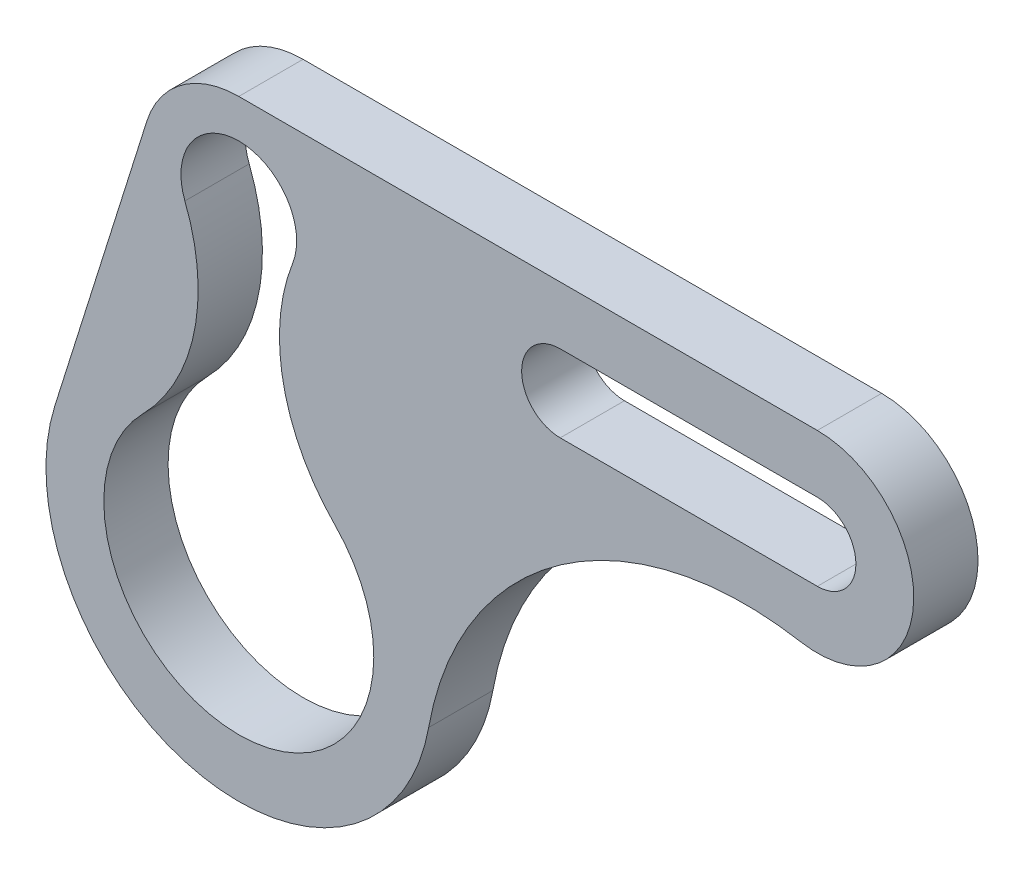
ISO-10303-21;
HEADER;
FILE_DESCRIPTION(('STEP AP214'),'2;1');
FILE_NAME('part.step','',(''),(''),'','','');
FILE_SCHEMA(('AUTOMOTIVE_DESIGN { 1 0 10303 214 1 1 1 1 }'));
ENDSEC;
DATA;
#1=APPLICATION_CONTEXT('core data for automotive mechanical design processes');
#2=APPLICATION_PROTOCOL_DEFINITION('international standard','automotive_design',2000,#1);
#3=PRODUCT_CONTEXT('',#1,'mechanical');
#4=PRODUCT('Part','Part','',(#3));
#5=PRODUCT_RELATED_PRODUCT_CATEGORY('part','',(#4));
#6=PRODUCT_DEFINITION_FORMATION('','',#4);
#7=PRODUCT_DEFINITION_CONTEXT('part definition',#1,'design');
#8=PRODUCT_DEFINITION('design','',#6,#7);
#9=PRODUCT_DEFINITION_SHAPE('','',#8);
#10=(LENGTH_UNIT() NAMED_UNIT(*) SI_UNIT(.MILLI.,.METRE.));
#11=(NAMED_UNIT(*) PLANE_ANGLE_UNIT() SI_UNIT($,.RADIAN.));
#12=(NAMED_UNIT(*) SI_UNIT($,.STERADIAN.) SOLID_ANGLE_UNIT());
#13=UNCERTAINTY_MEASURE_WITH_UNIT(LENGTH_MEASURE(1.E-05),#10,'distance_accuracy_value','');
#14=(GEOMETRIC_REPRESENTATION_CONTEXT(3) GLOBAL_UNCERTAINTY_ASSIGNED_CONTEXT((#13)) GLOBAL_UNIT_ASSIGNED_CONTEXT((#10,
#11,#12)) REPRESENTATION_CONTEXT('',''));
#15=CARTESIAN_POINT('',(0.,0.,0.));
#16=DIRECTION('',(0.,0.,1.));
#17=DIRECTION('',(1.,0.,0.));
#18=AXIS2_PLACEMENT_3D('',#15,#16,#17);
#19=CARTESIAN_POINT('',(0.,50.,5.));
#20=DIRECTION('',(0.,0.,1.));
#21=DIRECTION('',(1.,0.,0.));
#22=AXIS2_PLACEMENT_3D('',#19,#20,#21);
#23=PLANE('',#22);
#24=CARTESIAN_POINT('',(0.,50.,5.));
#25=DIRECTION('',(0.,0.,1.));
#26=DIRECTION('',(1.,0.,0.));
#27=AXIS2_PLACEMENT_3D('',#24,#25,#26);
#28=CIRCLE('',#27,15.);
#29=CARTESIAN_POINT('',(0.,65.,5.));
#30=VERTEX_POINT('',#29);
#31=CARTESIAN_POINT('',(-14.3090880212542,54.5,5.));
#32=VERTEX_POINT('',#31);
#33=EDGE_CURVE('E236',#30,#32,#28,.T.);
#34=ORIENTED_EDGE('',*,*,#33,.T.);
#35=DIRECTION('',(-0.3,-0.953939201416946,0.));
#36=VECTOR('',#35,1.);
#37=CARTESIAN_POINT('',(-14.3090880212542,54.5,5.));
#38=LINE('',#37,#36);
#39=CARTESIAN_POINT('',(-28.6181760425084,9.,5.));
#40=VERTEX_POINT('',#39);
#41=EDGE_CURVE('E240',#32,#40,#38,.T.);
#42=ORIENTED_EDGE('',*,*,#41,.T.);
#43=CARTESIAN_POINT('',(0.,0.,5.));
#44=DIRECTION('',(0.,0.,1.));
#45=DIRECTION('',(1.,0.,0.));
#46=AXIS2_PLACEMENT_3D('',#43,#44,#45);
#47=CIRCLE('',#46,30.);
#48=CARTESIAN_POINT('',(29.5356455942332,-5.25791206961977,5.));
#49=VERTEX_POINT('',#48);
#50=EDGE_CURVE('E244',#40,#49,#47,.T.);
#51=ORIENTED_EDGE('',*,*,#50,.T.);
#52=CARTESIAN_POINT('',(78.7617215846219,-14.0210988523194,5.));
#53=DIRECTION('',(0.,0.,-1.));
#54=DIRECTION('',(1.,0.,0.));
#55=AXIS2_PLACEMENT_3D('',#52,#53,#54);
#56=CIRCLE('',#55,50.);
#57=CARTESIAN_POINT('',(87.4065511349127,35.2259002648494,5.));
#58=VERTEX_POINT('',#57);
#59=EDGE_CURVE('E247',#49,#58,#56,.T.);
#60=ORIENTED_EDGE('',*,*,#59,.T.);
#61=CARTESIAN_POINT('',(90.,50.,5.));
#62=DIRECTION('',(0.,0.,1.));
#63=DIRECTION('',(-1.,0.,0.));
#64=AXIS2_PLACEMENT_3D('',#61,#62,#63);
#65=CIRCLE('',#64,15.);
#66=CARTESIAN_POINT('',(90.,65.,5.));
#67=VERTEX_POINT('',#66);
#68=EDGE_CURVE('E250',#58,#67,#65,.T.);
#69=ORIENTED_EDGE('',*,*,#68,.T.);
#70=DIRECTION('',(-1.,0.,0.));
#71=VECTOR('',#70,1.);
#72=CARTESIAN_POINT('',(0.,65.,5.));
#73=LINE('',#72,#71);
#74=EDGE_CURVE('E253',#67,#30,#73,.T.);
#75=ORIENTED_EDGE('',*,*,#74,.T.);
#76=EDGE_LOOP('',(#34,#42,#51,#60,#69,#75));
#77=FACE_BOUND('',#76,.T.);
#78=DIRECTION('',(1.,0.,0.));
#79=VECTOR('',#78,1.);
#80=CARTESIAN_POINT('',(50.,44.,5.));
#81=LINE('',#80,#79);
#82=CARTESIAN_POINT('',(50.,44.,5.));
#83=VERTEX_POINT('',#82);
#84=CARTESIAN_POINT('',(90.,44.,5.));
#85=VERTEX_POINT('',#84);
#86=EDGE_CURVE('E196',#83,#85,#81,.T.);
#87=ORIENTED_EDGE('',*,*,#86,.F.);
#88=CARTESIAN_POINT('',(50.,50.,5.));
#89=DIRECTION('',(0.,0.,1.));
#90=DIRECTION('',(1.,0.,0.));
#91=AXIS2_PLACEMENT_3D('',#88,#89,#90);
#92=CIRCLE('',#91,6.);
#93=CARTESIAN_POINT('',(50.,56.,5.));
#94=VERTEX_POINT('',#93);
#95=EDGE_CURVE('E193',#94,#83,#92,.T.);
#96=ORIENTED_EDGE('',*,*,#95,.F.);
#97=DIRECTION('',(-1.,0.,0.));
#98=VECTOR('',#97,1.);
#99=CARTESIAN_POINT('',(50.,56.,5.));
#100=LINE('',#99,#98);
#101=CARTESIAN_POINT('',(90.,56.,5.));
#102=VERTEX_POINT('',#101);
#103=EDGE_CURVE('E204',#102,#94,#100,.T.);
#104=ORIENTED_EDGE('',*,*,#103,.F.);
#105=CARTESIAN_POINT('',(90.,50.,5.));
#106=DIRECTION('',(0.,0.,1.));
#107=DIRECTION('',(1.,0.,0.));
#108=AXIS2_PLACEMENT_3D('',#105,#106,#107);
#109=CIRCLE('',#108,6.);
#110=EDGE_CURVE('E200',#85,#102,#109,.T.);
#111=ORIENTED_EDGE('',*,*,#110,.F.);
#112=EDGE_LOOP('',(#87,#96,#104,#111));
#113=FACE_BOUND('',#112,.T.);
#114=CARTESIAN_POINT('',(0.,50.,5.));
#115=DIRECTION('',(0.,0.,1.));
#116=DIRECTION('',(1.,0.,0.));
#117=AXIS2_PLACEMENT_3D('',#114,#115,#116);
#118=CIRCLE('',#117,9.00000000000001);
#119=CARTESIAN_POINT('',(8.3822297241205,46.7230769230769,5.));
#120=VERTEX_POINT('',#119);
#121=CARTESIAN_POINT('',(-8.38222972412048,46.7230769230769,5.));
#122=VERTEX_POINT('',#121);
#123=EDGE_CURVE('E154',#120,#122,#118,.T.);
#124=ORIENTED_EDGE('',*,*,#123,.F.);
#125=CARTESIAN_POINT('',(36.3229954711888,35.8,5.));
#126=DIRECTION('',(0.,0.,-1.));
#127=DIRECTION('',(1.,0.,0.));
#128=AXIS2_PLACEMENT_3D('',#125,#126,#127);
#129=CIRCLE('',#128,30.);
#130=CARTESIAN_POINT('',(14.9565275469601,14.7411764705882,5.));
#131=VERTEX_POINT('',#130);
#132=EDGE_CURVE('E145',#131,#120,#129,.T.);
#133=ORIENTED_EDGE('',*,*,#132,.F.);
#134=CARTESIAN_POINT('',(0.,0.,5.));
#135=DIRECTION('',(0.,0.,1.));
#136=DIRECTION('',(1.,0.,0.));
#137=AXIS2_PLACEMENT_3D('',#134,#135,#136);
#138=CIRCLE('',#137,21.);
#139=CARTESIAN_POINT('',(-14.9565275469601,14.7411764705882,5.));
#140=VERTEX_POINT('',#139);
#141=EDGE_CURVE('E171',#140,#131,#138,.T.);
#142=ORIENTED_EDGE('',*,*,#141,.F.);
#143=CARTESIAN_POINT('',(-36.3229954711888,35.8,5.));
#144=DIRECTION('',(0.,0.,-1.));
#145=DIRECTION('',(-1.,0.,0.));
#146=AXIS2_PLACEMENT_3D('',#143,#144,#145);
#147=CIRCLE('',#146,30.);
#148=EDGE_CURVE('E167',#122,#140,#147,.T.);
#149=ORIENTED_EDGE('',*,*,#148,.F.);
#150=EDGE_LOOP('',(#124,#133,#142,#149));
#151=FACE_BOUND('',#150,.T.);
#152=ADVANCED_FACE('F43',(#77,#113,#151),#23,.T.);
#153=CARTESIAN_POINT('',(0.,50.,-5.));
#154=DIRECTION('',(0.,0.,1.));
#155=DIRECTION('',(1.,0.,0.));
#156=AXIS2_PLACEMENT_3D('',#153,#154,#155);
#157=PLANE('',#156);
#158=CARTESIAN_POINT('',(50.,50.,-5.));
#159=DIRECTION('',(0.,0.,1.));
#160=DIRECTION('',(1.,0.,0.));
#161=AXIS2_PLACEMENT_3D('',#158,#159,#160);
#162=CIRCLE('',#161,6.);
#163=CARTESIAN_POINT('',(50.,56.,-5.));
#164=VERTEX_POINT('',#163);
#165=CARTESIAN_POINT('',(50.,44.,-5.));
#166=VERTEX_POINT('',#165);
#167=EDGE_CURVE('E163',#164,#166,#162,.T.);
#168=ORIENTED_EDGE('',*,*,#167,.T.);
#169=DIRECTION('',(1.,0.,0.));
#170=VECTOR('',#169,1.);
#171=CARTESIAN_POINT('',(50.,44.,-5.));
#172=LINE('',#171,#170);
#173=CARTESIAN_POINT('',(90.,44.,-5.));
#174=VERTEX_POINT('',#173);
#175=EDGE_CURVE('E211',#166,#174,#172,.T.);
#176=ORIENTED_EDGE('',*,*,#175,.T.);
#177=CARTESIAN_POINT('',(90.,50.,-5.));
#178=DIRECTION('',(0.,0.,1.));
#179=DIRECTION('',(1.,0.,0.));
#180=AXIS2_PLACEMENT_3D('',#177,#178,#179);
#181=CIRCLE('',#180,6.);
#182=CARTESIAN_POINT('',(90.,56.,-5.));
#183=VERTEX_POINT('',#182);
#184=EDGE_CURVE('E215',#174,#183,#181,.T.);
#185=ORIENTED_EDGE('',*,*,#184,.T.);
#186=DIRECTION('',(-1.,0.,0.));
#187=VECTOR('',#186,1.);
#188=CARTESIAN_POINT('',(50.,56.,-5.));
#189=LINE('',#188,#187);
#190=EDGE_CURVE('E197',#183,#164,#189,.T.);
#191=ORIENTED_EDGE('',*,*,#190,.T.);
#192=EDGE_LOOP('',(#168,#176,#185,#191));
#193=FACE_BOUND('',#192,.T.);
#194=CARTESIAN_POINT('',(0.,50.,-5.));
#195=DIRECTION('',(0.,0.,1.));
#196=DIRECTION('',(1.,0.,0.));
#197=AXIS2_PLACEMENT_3D('',#194,#195,#196);
#198=CIRCLE('',#197,15.);
#199=CARTESIAN_POINT('',(0.,65.,-5.));
#200=VERTEX_POINT('',#199);
#201=CARTESIAN_POINT('',(-14.3090880212542,54.5,-5.));
#202=VERTEX_POINT('',#201);
#203=EDGE_CURVE('E235',#200,#202,#198,.T.);
#204=ORIENTED_EDGE('',*,*,#203,.F.);
#205=DIRECTION('',(-1.,0.,0.));
#206=VECTOR('',#205,1.);
#207=CARTESIAN_POINT('',(0.,65.,-5.));
#208=LINE('',#207,#206);
#209=CARTESIAN_POINT('',(90.,65.,-5.));
#210=VERTEX_POINT('',#209);
#211=EDGE_CURVE('E241',#210,#200,#208,.T.);
#212=ORIENTED_EDGE('',*,*,#211,.F.);
#213=CARTESIAN_POINT('',(90.,50.,-5.));
#214=DIRECTION('',(0.,0.,1.));
#215=DIRECTION('',(-1.,0.,0.));
#216=AXIS2_PLACEMENT_3D('',#213,#214,#215);
#217=CIRCLE('',#216,15.);
#218=CARTESIAN_POINT('',(87.4065511349127,35.2259002648494,-5.));
#219=VERTEX_POINT('',#218);
#220=EDGE_CURVE('E269',#219,#210,#217,.T.);
#221=ORIENTED_EDGE('',*,*,#220,.F.);
#222=CARTESIAN_POINT('',(78.7617215846219,-14.0210988523194,-5.));
#223=DIRECTION('',(0.,0.,-1.));
#224=DIRECTION('',(1.,0.,0.));
#225=AXIS2_PLACEMENT_3D('',#222,#223,#224);
#226=CIRCLE('',#225,50.);
#227=CARTESIAN_POINT('',(29.5356455942332,-5.25791206961977,-5.));
#228=VERTEX_POINT('',#227);
#229=EDGE_CURVE('E266',#228,#219,#226,.T.);
#230=ORIENTED_EDGE('',*,*,#229,.F.);
#231=CARTESIAN_POINT('',(0.,0.,-5.));
#232=DIRECTION('',(0.,0.,1.));
#233=DIRECTION('',(1.,0.,0.));
#234=AXIS2_PLACEMENT_3D('',#231,#232,#233);
#235=CIRCLE('',#234,30.);
#236=CARTESIAN_POINT('',(-28.6181760425084,9.,-5.));
#237=VERTEX_POINT('',#236);
#238=EDGE_CURVE('E263',#237,#228,#235,.T.);
#239=ORIENTED_EDGE('',*,*,#238,.F.);
#240=DIRECTION('',(-0.3,-0.953939201416946,0.));
#241=VECTOR('',#240,1.);
#242=CARTESIAN_POINT('',(-14.3090880212542,54.5,-5.));
#243=LINE('',#242,#241);
#244=EDGE_CURVE('E260',#202,#237,#243,.T.);
#245=ORIENTED_EDGE('',*,*,#244,.F.);
#246=EDGE_LOOP('',(#204,#212,#221,#230,#239,#245));
#247=FACE_BOUND('',#246,.T.);
#248=CARTESIAN_POINT('',(36.3229954711888,35.8,-5.));
#249=DIRECTION('',(0.,0.,-1.));
#250=DIRECTION('',(1.,0.,0.));
#251=AXIS2_PLACEMENT_3D('',#248,#249,#250);
#252=CIRCLE('',#251,30.);
#253=CARTESIAN_POINT('',(14.9565275469601,14.7411764705882,-5.));
#254=VERTEX_POINT('',#253);
#255=CARTESIAN_POINT('',(8.3822297241205,46.7230769230769,-5.));
#256=VERTEX_POINT('',#255);
#257=EDGE_CURVE('E67',#254,#256,#252,.T.);
#258=ORIENTED_EDGE('',*,*,#257,.T.);
#259=CARTESIAN_POINT('',(0.,50.,-5.));
#260=DIRECTION('',(0.,0.,1.));
#261=DIRECTION('',(1.,0.,0.));
#262=AXIS2_PLACEMENT_3D('',#259,#260,#261);
#263=CIRCLE('',#262,9.00000000000001);
#264=CARTESIAN_POINT('',(-8.38222972412048,46.7230769230769,-5.));
#265=VERTEX_POINT('',#264);
#266=EDGE_CURVE('E161',#256,#265,#263,.T.);
#267=ORIENTED_EDGE('',*,*,#266,.T.);
#268=CARTESIAN_POINT('',(-36.3229954711888,35.8,-5.));
#269=DIRECTION('',(0.,0.,-1.));
#270=DIRECTION('',(-1.,0.,0.));
#271=AXIS2_PLACEMENT_3D('',#268,#269,#270);
#272=CIRCLE('',#271,30.);
#273=CARTESIAN_POINT('',(-14.9565275469601,14.7411764705882,-5.));
#274=VERTEX_POINT('',#273);
#275=EDGE_CURVE('E180',#265,#274,#272,.T.);
#276=ORIENTED_EDGE('',*,*,#275,.T.);
#277=CARTESIAN_POINT('',(0.,0.,-5.));
#278=DIRECTION('',(0.,0.,1.));
#279=DIRECTION('',(1.,0.,0.));
#280=AXIS2_PLACEMENT_3D('',#277,#278,#279);
#281=CIRCLE('',#280,21.);
#282=EDGE_CURVE('E155',#274,#254,#281,.T.);
#283=ORIENTED_EDGE('',*,*,#282,.T.);
#284=EDGE_LOOP('',(#258,#267,#276,#283));
#285=FACE_BOUND('',#284,.T.);
#286=ADVANCED_FACE('F300',(#193,#247,#285),#157,.F.);
#287=CARTESIAN_POINT('',(0.,50.,5.));
#288=DIRECTION('',(0.,0.,-1.));
#289=DIRECTION('',(-1.,0.,0.));
#290=AXIS2_PLACEMENT_3D('',#287,#288,#289);
#291=CYLINDRICAL_SURFACE('',#290,15.);
#292=ORIENTED_EDGE('',*,*,#203,.T.);
#293=DIRECTION('',(0.,0.,-1.));
#294=VECTOR('',#293,1.);
#295=CARTESIAN_POINT('',(-14.3090880212542,54.5,5.));
#296=LINE('',#295,#294);
#297=EDGE_CURVE('E11',#32,#202,#296,.T.);
#298=ORIENTED_EDGE('',*,*,#297,.F.);
#299=ORIENTED_EDGE('',*,*,#33,.F.);
#300=DIRECTION('',(0.,0.,-1.));
#301=VECTOR('',#300,1.);
#302=CARTESIAN_POINT('',(0.,65.,5.));
#303=LINE('',#302,#301);
#304=EDGE_CURVE('E256',#30,#200,#303,.T.);
#305=ORIENTED_EDGE('',*,*,#304,.T.);
#306=EDGE_LOOP('',(#292,#298,#299,#305));
#307=FACE_BOUND('',#306,.T.);
#308=ADVANCED_FACE('F45',(#307),#291,.T.);
#309=CARTESIAN_POINT('',(-14.3090880212542,54.5,5.));
#310=DIRECTION('',(0.953939201416946,-0.3,0.));
#311=DIRECTION('',(0.3,0.953939201416946,0.));
#312=AXIS2_PLACEMENT_3D('',#309,#310,#311);
#313=PLANE('',#312);
#314=ORIENTED_EDGE('',*,*,#244,.T.);
#315=DIRECTION('',(0.,0.,-1.));
#316=VECTOR('',#315,1.);
#317=CARTESIAN_POINT('',(-28.6181760425084,9.,5.));
#318=LINE('',#317,#316);
#319=EDGE_CURVE('E52',#40,#237,#318,.T.);
#320=ORIENTED_EDGE('',*,*,#319,.F.);
#321=ORIENTED_EDGE('',*,*,#41,.F.);
#322=ORIENTED_EDGE('',*,*,#297,.T.);
#323=EDGE_LOOP('',(#314,#320,#321,#322));
#324=FACE_BOUND('',#323,.T.);
#325=ADVANCED_FACE('F318',(#324),#313,.F.);
#326=CARTESIAN_POINT('',(0.,0.,5.));
#327=DIRECTION('',(0.,0.,-1.));
#328=DIRECTION('',(-1.,0.,0.));
#329=AXIS2_PLACEMENT_3D('',#326,#327,#328);
#330=CYLINDRICAL_SURFACE('',#329,30.);
#331=ORIENTED_EDGE('',*,*,#238,.T.);
#332=DIRECTION('',(0.,0.,-1.));
#333=VECTOR('',#332,1.);
#334=CARTESIAN_POINT('',(29.5356455942332,-5.25791206961977,5.));
#335=LINE('',#334,#333);
#336=EDGE_CURVE('E285',#49,#228,#335,.T.);
#337=ORIENTED_EDGE('',*,*,#336,.F.);
#338=ORIENTED_EDGE('',*,*,#50,.F.);
#339=ORIENTED_EDGE('',*,*,#319,.T.);
#340=EDGE_LOOP('',(#331,#337,#338,#339));
#341=FACE_BOUND('',#340,.T.);
#342=ADVANCED_FACE('F294',(#341),#330,.T.);
#343=CARTESIAN_POINT('',(78.7617215846219,-14.0210988523194,5.));
#344=DIRECTION('',(0.,0.,-1.));
#345=DIRECTION('',(-1.,0.,0.));
#346=AXIS2_PLACEMENT_3D('',#343,#344,#345);
#347=CYLINDRICAL_SURFACE('',#346,50.);
#348=ORIENTED_EDGE('',*,*,#229,.T.);
#349=DIRECTION('',(0.,0.,-1.));
#350=VECTOR('',#349,1.);
#351=CARTESIAN_POINT('',(87.4065511349127,35.2259002648494,5.));
#352=LINE('',#351,#350);
#353=EDGE_CURVE('E281',#58,#219,#352,.T.);
#354=ORIENTED_EDGE('',*,*,#353,.F.);
#355=ORIENTED_EDGE('',*,*,#59,.F.);
#356=ORIENTED_EDGE('',*,*,#336,.T.);
#357=EDGE_LOOP('',(#348,#354,#355,#356));
#358=FACE_BOUND('',#357,.T.);
#359=ADVANCED_FACE('F306',(#358),#347,.F.);
#360=CARTESIAN_POINT('',(90.,50.,5.));
#361=DIRECTION('',(0.,0.,-1.));
#362=DIRECTION('',(-1.,0.,0.));
#363=AXIS2_PLACEMENT_3D('',#360,#361,#362);
#364=CYLINDRICAL_SURFACE('',#363,15.);
#365=ORIENTED_EDGE('',*,*,#220,.T.);
#366=DIRECTION('',(0.,0.,-1.));
#367=VECTOR('',#366,1.);
#368=CARTESIAN_POINT('',(90.,65.,5.));
#369=LINE('',#368,#367);
#370=EDGE_CURVE('E277',#67,#210,#369,.T.);
#371=ORIENTED_EDGE('',*,*,#370,.F.);
#372=ORIENTED_EDGE('',*,*,#68,.F.);
#373=ORIENTED_EDGE('',*,*,#353,.T.);
#374=EDGE_LOOP('',(#365,#371,#372,#373));
#375=FACE_BOUND('',#374,.T.);
#376=ADVANCED_FACE('F310',(#375),#364,.T.);
#377=CARTESIAN_POINT('',(0.,65.,5.));
#378=DIRECTION('',(0.,-1.,0.));
#379=DIRECTION('',(0.,0.,-1.));
#380=AXIS2_PLACEMENT_3D('',#377,#378,#379);
#381=PLANE('',#380);
#382=ORIENTED_EDGE('',*,*,#211,.T.);
#383=ORIENTED_EDGE('',*,*,#304,.F.);
#384=ORIENTED_EDGE('',*,*,#74,.F.);
#385=ORIENTED_EDGE('',*,*,#370,.T.);
#386=EDGE_LOOP('',(#382,#383,#384,#385));
#387=FACE_BOUND('',#386,.T.);
#388=ADVANCED_FACE('F321',(#387),#381,.F.);
#389=CARTESIAN_POINT('',(50.,50.,5.));
#390=DIRECTION('',(0.,0.,-1.));
#391=DIRECTION('',(-1.,0.,0.));
#392=AXIS2_PLACEMENT_3D('',#389,#390,#391);
#393=CYLINDRICAL_SURFACE('',#392,6.);
#394=ORIENTED_EDGE('',*,*,#167,.F.);
#395=DIRECTION('',(0.,0.,-1.));
#396=VECTOR('',#395,1.);
#397=CARTESIAN_POINT('',(50.,56.,5.));
#398=LINE('',#397,#396);
#399=EDGE_CURVE('E207',#94,#164,#398,.T.);
#400=ORIENTED_EDGE('',*,*,#399,.F.);
#401=ORIENTED_EDGE('',*,*,#95,.T.);
#402=DIRECTION('',(0.,0.,-1.));
#403=VECTOR('',#402,1.);
#404=CARTESIAN_POINT('',(50.,44.,5.));
#405=LINE('',#404,#403);
#406=EDGE_CURVE('E231',#83,#166,#405,.T.);
#407=ORIENTED_EDGE('',*,*,#406,.T.);
#408=EDGE_LOOP('',(#394,#400,#401,#407));
#409=FACE_BOUND('',#408,.T.);
#410=ADVANCED_FACE('F323',(#409),#393,.F.);
#411=CARTESIAN_POINT('',(50.,44.,5.));
#412=DIRECTION('',(0.,1.,0.));
#413=DIRECTION('',(0.,0.,1.));
#414=AXIS2_PLACEMENT_3D('',#411,#412,#413);
#415=PLANE('',#414);
#416=ORIENTED_EDGE('',*,*,#175,.F.);
#417=ORIENTED_EDGE('',*,*,#406,.F.);
#418=ORIENTED_EDGE('',*,*,#86,.T.);
#419=DIRECTION('',(0.,0.,-1.));
#420=VECTOR('',#419,1.);
#421=CARTESIAN_POINT('',(90.,44.,5.));
#422=LINE('',#421,#420);
#423=EDGE_CURVE('E228',#85,#174,#422,.T.);
#424=ORIENTED_EDGE('',*,*,#423,.T.);
#425=EDGE_LOOP('',(#416,#417,#418,#424));
#426=FACE_BOUND('',#425,.T.);
#427=ADVANCED_FACE('F329',(#426),#415,.T.);
#428=CARTESIAN_POINT('',(90.,50.,5.));
#429=DIRECTION('',(0.,0.,-1.));
#430=DIRECTION('',(-1.,0.,0.));
#431=AXIS2_PLACEMENT_3D('',#428,#429,#430);
#432=CYLINDRICAL_SURFACE('',#431,6.);
#433=ORIENTED_EDGE('',*,*,#184,.F.);
#434=ORIENTED_EDGE('',*,*,#423,.F.);
#435=ORIENTED_EDGE('',*,*,#110,.T.);
#436=DIRECTION('',(0.,0.,-1.));
#437=VECTOR('',#436,1.);
#438=CARTESIAN_POINT('',(90.,56.,5.));
#439=LINE('',#438,#437);
#440=EDGE_CURVE('E225',#102,#183,#439,.T.);
#441=ORIENTED_EDGE('',*,*,#440,.T.);
#442=EDGE_LOOP('',(#433,#434,#435,#441));
#443=FACE_BOUND('',#442,.T.);
#444=ADVANCED_FACE('F343',(#443),#432,.F.);
#445=CARTESIAN_POINT('',(50.,56.,5.));
#446=DIRECTION('',(0.,-1.,0.));
#447=DIRECTION('',(0.,0.,-1.));
#448=AXIS2_PLACEMENT_3D('',#445,#446,#447);
#449=PLANE('',#448);
#450=ORIENTED_EDGE('',*,*,#190,.F.);
#451=ORIENTED_EDGE('',*,*,#440,.F.);
#452=ORIENTED_EDGE('',*,*,#103,.T.);
#453=ORIENTED_EDGE('',*,*,#399,.T.);
#454=EDGE_LOOP('',(#450,#451,#452,#453));
#455=FACE_BOUND('',#454,.T.);
#456=ADVANCED_FACE('F347',(#455),#449,.T.);
#457=CARTESIAN_POINT('',(36.3229954711888,35.8,5.));
#458=DIRECTION('',(0.,0.,-1.));
#459=DIRECTION('',(-1.,0.,0.));
#460=AXIS2_PLACEMENT_3D('',#457,#458,#459);
#461=CYLINDRICAL_SURFACE('',#460,30.);
#462=ORIENTED_EDGE('',*,*,#257,.F.);
#463=DIRECTION('',(0.,0.,-1.));
#464=VECTOR('',#463,1.);
#465=CARTESIAN_POINT('',(14.9565275469601,14.7411764705882,5.));
#466=LINE('',#465,#464);
#467=EDGE_CURVE('E149',#131,#254,#466,.T.);
#468=ORIENTED_EDGE('',*,*,#467,.F.);
#469=ORIENTED_EDGE('',*,*,#132,.T.);
#470=DIRECTION('',(0.,0.,-1.));
#471=VECTOR('',#470,1.);
#472=CARTESIAN_POINT('',(8.3822297241205,46.7230769230769,5.));
#473=LINE('',#472,#471);
#474=EDGE_CURVE('E148',#120,#256,#473,.T.);
#475=ORIENTED_EDGE('',*,*,#474,.T.);
#476=EDGE_LOOP('',(#462,#468,#469,#475));
#477=FACE_BOUND('',#476,.T.);
#478=ADVANCED_FACE('F147',(#477),#461,.T.);
#479=CARTESIAN_POINT('',(0.,50.,5.));
#480=DIRECTION('',(0.,0.,-1.));
#481=DIRECTION('',(-1.,0.,0.));
#482=AXIS2_PLACEMENT_3D('',#479,#480,#481);
#483=CYLINDRICAL_SURFACE('',#482,9.00000000000001);
#484=ORIENTED_EDGE('',*,*,#266,.F.);
#485=ORIENTED_EDGE('',*,*,#474,.F.);
#486=ORIENTED_EDGE('',*,*,#123,.T.);
#487=DIRECTION('',(0.,0.,-1.));
#488=VECTOR('',#487,1.);
#489=CARTESIAN_POINT('',(-8.38222972412048,46.7230769230769,5.));
#490=LINE('',#489,#488);
#491=EDGE_CURVE('E164',#122,#265,#490,.T.);
#492=ORIENTED_EDGE('',*,*,#491,.T.);
#493=EDGE_LOOP('',(#484,#485,#486,#492));
#494=FACE_BOUND('',#493,.T.);
#495=ADVANCED_FACE('F158',(#494),#483,.F.);
#496=CARTESIAN_POINT('',(-36.3229954711888,35.8,5.));
#497=DIRECTION('',(0.,0.,-1.));
#498=DIRECTION('',(-1.,0.,0.));
#499=AXIS2_PLACEMENT_3D('',#496,#497,#498);
#500=CYLINDRICAL_SURFACE('',#499,30.);
#501=ORIENTED_EDGE('',*,*,#275,.F.);
#502=ORIENTED_EDGE('',*,*,#491,.F.);
#503=ORIENTED_EDGE('',*,*,#148,.T.);
#504=DIRECTION('',(0.,0.,-1.));
#505=VECTOR('',#504,1.);
#506=CARTESIAN_POINT('',(-14.9565275469601,14.7411764705882,5.));
#507=LINE('',#506,#505);
#508=EDGE_CURVE('E59',#140,#274,#507,.T.);
#509=ORIENTED_EDGE('',*,*,#508,.T.);
#510=EDGE_LOOP('',(#501,#502,#503,#509));
#511=FACE_BOUND('',#510,.T.);
#512=ADVANCED_FACE('F356',(#511),#500,.T.);
#513=CARTESIAN_POINT('',(0.,0.,5.));
#514=DIRECTION('',(0.,0.,-1.));
#515=DIRECTION('',(-1.,0.,0.));
#516=AXIS2_PLACEMENT_3D('',#513,#514,#515);
#517=CYLINDRICAL_SURFACE('',#516,21.);
#518=ORIENTED_EDGE('',*,*,#282,.F.);
#519=ORIENTED_EDGE('',*,*,#508,.F.);
#520=ORIENTED_EDGE('',*,*,#141,.T.);
#521=ORIENTED_EDGE('',*,*,#467,.T.);
#522=EDGE_LOOP('',(#518,#519,#520,#521));
#523=FACE_BOUND('',#522,.T.);
#524=ADVANCED_FACE('F359',(#523),#517,.F.);
#525=CLOSED_SHELL('',(#152,#286,#308,#325,#342,#359,#376,#388,#410,#427,#444,#456,#478,#495,
#512,#524));
#526=MANIFOLD_SOLID_BREP('B2',#525);
#527=ADVANCED_BREP_SHAPE_REPRESENTATION('',(#18,#526),#14);
#528=SHAPE_DEFINITION_REPRESENTATION(#9,#527);
ENDSEC;
END-ISO-10303-21;
